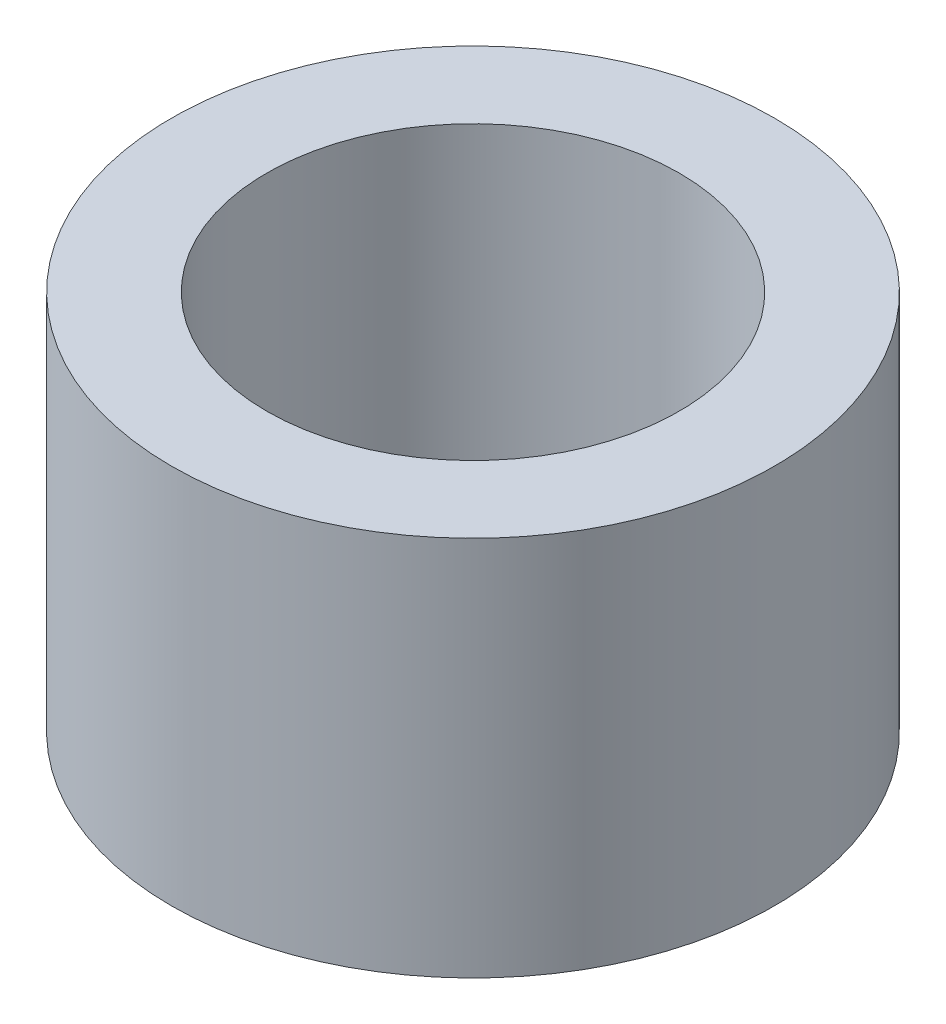
ISO-10303-21;
HEADER;
FILE_DESCRIPTION(('STEP AP214'),'2;1');
FILE_NAME('part.step','',(''),(''),'','','');
FILE_SCHEMA(('AUTOMOTIVE_DESIGN { 1 0 10303 214 1 1 1 1 }'));
ENDSEC;
DATA;
#1=APPLICATION_CONTEXT('core data for automotive mechanical design processes');
#2=APPLICATION_PROTOCOL_DEFINITION('international standard','automotive_design',2000,#1);
#3=PRODUCT_CONTEXT('',#1,'mechanical');
#4=PRODUCT('Part','Part','',(#3));
#5=PRODUCT_RELATED_PRODUCT_CATEGORY('part','',(#4));
#6=PRODUCT_DEFINITION_FORMATION('','',#4);
#7=PRODUCT_DEFINITION_CONTEXT('part definition',#1,'design');
#8=PRODUCT_DEFINITION('design','',#6,#7);
#9=PRODUCT_DEFINITION_SHAPE('','',#8);
#10=(LENGTH_UNIT() NAMED_UNIT(*) SI_UNIT(.MILLI.,.METRE.));
#11=(NAMED_UNIT(*) PLANE_ANGLE_UNIT() SI_UNIT($,.RADIAN.));
#12=(NAMED_UNIT(*) SI_UNIT($,.STERADIAN.) SOLID_ANGLE_UNIT());
#13=UNCERTAINTY_MEASURE_WITH_UNIT(LENGTH_MEASURE(1.E-05),#10,'distance_accuracy_value','');
#14=(GEOMETRIC_REPRESENTATION_CONTEXT(3) GLOBAL_UNCERTAINTY_ASSIGNED_CONTEXT((#13)) GLOBAL_UNIT_ASSIGNED_CONTEXT((#10,
#11,#12)) REPRESENTATION_CONTEXT('',''));
#15=CARTESIAN_POINT('',(0.,0.,0.));
#16=DIRECTION('',(0.,0.,1.));
#17=DIRECTION('',(1.,0.,0.));
#18=AXIS2_PLACEMENT_3D('',#15,#16,#17);
#19=CARTESIAN_POINT('',(0.,6.,0.));
#20=DIRECTION('',(0.,1.,0.));
#21=DIRECTION('',(0.,0.,1.));
#22=AXIS2_PLACEMENT_3D('',#19,#20,#21);
#23=PLANE('',#22);
#24=CARTESIAN_POINT('',(0.,6.,0.));
#25=DIRECTION('',(0.,1.,0.));
#26=DIRECTION('',(0.,0.,1.));
#27=AXIS2_PLACEMENT_3D('',#24,#25,#26);
#28=CIRCLE('',#27,4.75);
#29=CARTESIAN_POINT('',(0.,6.,4.75));
#30=VERTEX_POINT('',#29);
#31=EDGE_CURVE('E10',#30,#30,#28,.T.);
#32=ORIENTED_EDGE('',*,*,#31,.T.);
#33=EDGE_LOOP('',(#32));
#34=FACE_BOUND('',#33,.T.);
#35=CARTESIAN_POINT('',(0.,6.,0.));
#36=DIRECTION('',(0.,1.,0.));
#37=DIRECTION('',(0.,0.,1.));
#38=AXIS2_PLACEMENT_3D('',#35,#36,#37);
#39=CIRCLE('',#38,3.25);
#40=CARTESIAN_POINT('',(0.,6.,3.25));
#41=VERTEX_POINT('',#40);
#42=EDGE_CURVE('E41',#41,#41,#39,.T.);
#43=ORIENTED_EDGE('',*,*,#42,.F.);
#44=EDGE_LOOP('',(#43));
#45=FACE_BOUND('',#44,.T.);
#46=ADVANCED_FACE('F30',(#34,#45),#23,.T.);
#47=CARTESIAN_POINT('',(0.,0.,0.));
#48=DIRECTION('',(0.,1.,0.));
#49=DIRECTION('',(0.,0.,1.));
#50=AXIS2_PLACEMENT_3D('',#47,#48,#49);
#51=PLANE('',#50);
#52=CARTESIAN_POINT('',(0.,0.,0.));
#53=DIRECTION('',(0.,1.,0.));
#54=DIRECTION('',(0.,0.,1.));
#55=AXIS2_PLACEMENT_3D('',#52,#53,#54);
#56=CIRCLE('',#55,4.75);
#57=CARTESIAN_POINT('',(0.,0.,4.75));
#58=VERTEX_POINT('',#57);
#59=EDGE_CURVE('E34',#58,#58,#56,.T.);
#60=ORIENTED_EDGE('',*,*,#59,.F.);
#61=EDGE_LOOP('',(#60));
#62=FACE_BOUND('',#61,.T.);
#63=CARTESIAN_POINT('',(0.,0.,0.));
#64=DIRECTION('',(0.,1.,0.));
#65=DIRECTION('',(0.,0.,1.));
#66=AXIS2_PLACEMENT_3D('',#63,#64,#65);
#67=CIRCLE('',#66,3.25);
#68=CARTESIAN_POINT('',(0.,0.,3.25));
#69=VERTEX_POINT('',#68);
#70=EDGE_CURVE('E43',#69,#69,#67,.T.);
#71=ORIENTED_EDGE('',*,*,#70,.T.);
#72=EDGE_LOOP('',(#71));
#73=FACE_BOUND('',#72,.T.);
#74=ADVANCED_FACE('F53',(#62,#73),#51,.F.);
#75=CARTESIAN_POINT('',(0.,6.,0.));
#76=DIRECTION('',(0.,-1.,0.));
#77=DIRECTION('',(0.,0.,-1.));
#78=AXIS2_PLACEMENT_3D('',#75,#76,#77);
#79=CYLINDRICAL_SURFACE('',#78,4.75);
#80=ORIENTED_EDGE('',*,*,#31,.F.);
#81=EDGE_LOOP('',(#80));
#82=FACE_BOUND('',#81,.T.);
#83=ORIENTED_EDGE('',*,*,#59,.T.);
#84=EDGE_LOOP('',(#83));
#85=FACE_BOUND('',#84,.T.);
#86=ADVANCED_FACE('F32',(#82,#85),#79,.T.);
#87=CARTESIAN_POINT('',(0.,6.,0.));
#88=DIRECTION('',(0.,-1.,0.));
#89=DIRECTION('',(0.,0.,-1.));
#90=AXIS2_PLACEMENT_3D('',#87,#88,#89);
#91=CYLINDRICAL_SURFACE('',#90,3.25);
#92=ORIENTED_EDGE('',*,*,#42,.T.);
#93=EDGE_LOOP('',(#92));
#94=FACE_BOUND('',#93,.T.);
#95=ORIENTED_EDGE('',*,*,#70,.F.);
#96=EDGE_LOOP('',(#95));
#97=FACE_BOUND('',#96,.T.);
#98=ADVANCED_FACE('F49',(#94,#97),#91,.F.);
#99=CLOSED_SHELL('',(#46,#74,#86,#98));
#100=MANIFOLD_SOLID_BREP('B2',#99);
#101=ADVANCED_BREP_SHAPE_REPRESENTATION('',(#18,#100),#14);
#102=SHAPE_DEFINITION_REPRESENTATION(#9,#101);
ENDSEC;
END-ISO-10303-21;
